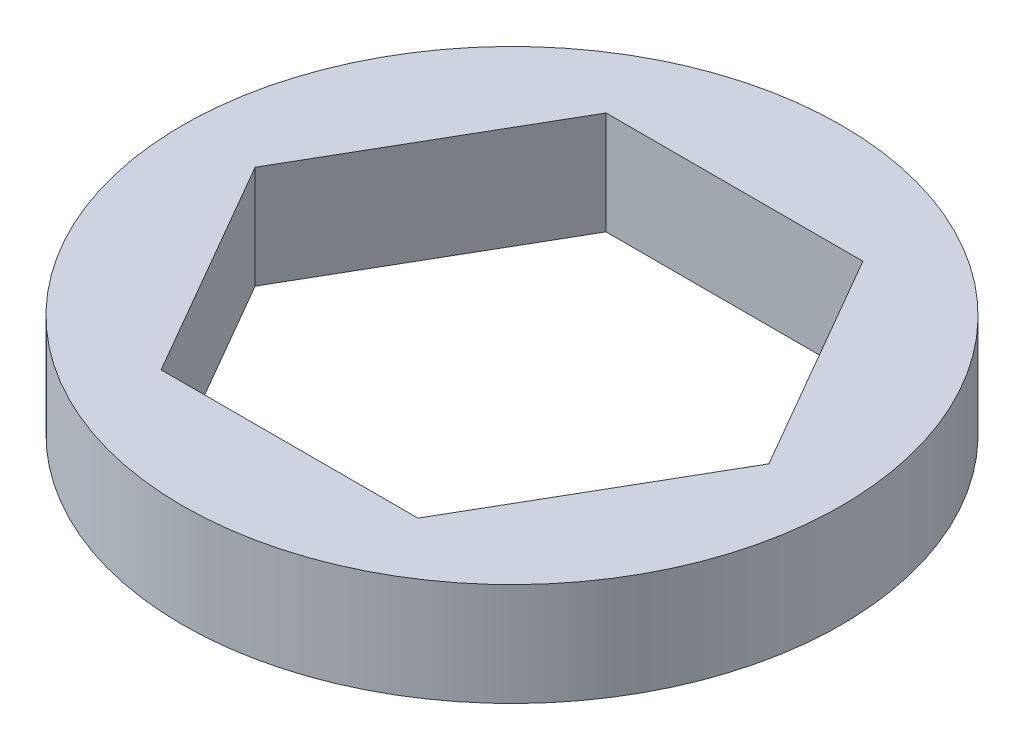
ISO-10303-21;
HEADER;
FILE_DESCRIPTION(('STEP AP214'),'2;1');
FILE_NAME('part.step','',(''),(''),'','','');
FILE_SCHEMA(('AUTOMOTIVE_DESIGN { 1 0 10303 214 1 1 1 1 }'));
ENDSEC;
DATA;
#1=APPLICATION_CONTEXT('core data for automotive mechanical design processes');
#2=APPLICATION_PROTOCOL_DEFINITION('international standard','automotive_design',2000,#1);
#3=PRODUCT_CONTEXT('',#1,'mechanical');
#4=PRODUCT('Part','Part','',(#3));
#5=PRODUCT_RELATED_PRODUCT_CATEGORY('part','',(#4));
#6=PRODUCT_DEFINITION_FORMATION('','',#4);
#7=PRODUCT_DEFINITION_CONTEXT('part definition',#1,'design');
#8=PRODUCT_DEFINITION('design','',#6,#7);
#9=PRODUCT_DEFINITION_SHAPE('','',#8);
#10=(LENGTH_UNIT() NAMED_UNIT(*) SI_UNIT(.MILLI.,.METRE.));
#11=(NAMED_UNIT(*) PLANE_ANGLE_UNIT() SI_UNIT($,.RADIAN.));
#12=(NAMED_UNIT(*) SI_UNIT($,.STERADIAN.) SOLID_ANGLE_UNIT());
#13=UNCERTAINTY_MEASURE_WITH_UNIT(LENGTH_MEASURE(1.E-05),#10,'distance_accuracy_value','');
#14=(GEOMETRIC_REPRESENTATION_CONTEXT(3) GLOBAL_UNCERTAINTY_ASSIGNED_CONTEXT((#13)) GLOBAL_UNIT_ASSIGNED_CONTEXT((#10,
#11,#12)) REPRESENTATION_CONTEXT('',''));
#15=CARTESIAN_POINT('',(0.,0.,0.));
#16=DIRECTION('',(0.,0.,1.));
#17=DIRECTION('',(1.,0.,0.));
#18=AXIS2_PLACEMENT_3D('',#15,#16,#17);
#19=CARTESIAN_POINT('',(0.,3.175,0.));
#20=DIRECTION('',(0.,1.,0.));
#21=DIRECTION('',(0.,0.,1.));
#22=AXIS2_PLACEMENT_3D('',#19,#20,#21);
#23=PLANE('',#22);
#24=CARTESIAN_POINT('',(0.,3.175,0.));
#25=DIRECTION('',(0.,1.,0.));
#26=DIRECTION('',(0.,0.,1.));
#27=AXIS2_PLACEMENT_3D('',#24,#25,#26);
#28=CIRCLE('',#27,10.16);
#29=CARTESIAN_POINT('',(0.,3.175,10.16));
#30=VERTEX_POINT('',#29);
#31=EDGE_CURVE('E11',#30,#30,#28,.T.);
#32=ORIENTED_EDGE('',*,*,#31,.T.);
#33=EDGE_LOOP('',(#32));
#34=FACE_BOUND('',#33,.T.);
#35=DIRECTION('',(-0.5,0.,-0.866025403784438));
#36=VECTOR('',#35,1.);
#37=CARTESIAN_POINT('',(7.9189362922049,3.175,0.));
#38=LINE('',#37,#36);
#39=CARTESIAN_POINT('',(7.9189362922049,3.175,0.));
#40=VERTEX_POINT('',#39);
#41=CARTESIAN_POINT('',(3.95946814610245,3.175,-6.858));
#42=VERTEX_POINT('',#41);
#43=EDGE_CURVE('E115',#40,#42,#38,.T.);
#44=ORIENTED_EDGE('',*,*,#43,.F.);
#45=DIRECTION('',(0.5,0.,-0.866025403784439));
#46=VECTOR('',#45,1.);
#47=CARTESIAN_POINT('',(3.95946814610245,3.175,6.858));
#48=LINE('',#47,#46);
#49=CARTESIAN_POINT('',(3.95946814610245,3.175,6.858));
#50=VERTEX_POINT('',#49);
#51=EDGE_CURVE('E106',#50,#40,#48,.T.);
#52=ORIENTED_EDGE('',*,*,#51,.F.);
#53=DIRECTION('',(1.,0.,0.));
#54=VECTOR('',#53,1.);
#55=CARTESIAN_POINT('',(-3.95946814610245,3.175,6.858));
#56=LINE('',#55,#54);
#57=CARTESIAN_POINT('',(-3.95946814610245,3.175,6.858));
#58=VERTEX_POINT('',#57);
#59=EDGE_CURVE('E141',#58,#50,#56,.T.);
#60=ORIENTED_EDGE('',*,*,#59,.F.);
#61=DIRECTION('',(0.5,0.,0.866025403784439));
#62=VECTOR('',#61,1.);
#63=CARTESIAN_POINT('',(-7.91893629220491,3.175,0.));
#64=LINE('',#63,#62);
#65=CARTESIAN_POINT('',(-7.91893629220491,3.175,0.));
#66=VERTEX_POINT('',#65);
#67=EDGE_CURVE('E138',#66,#58,#64,.T.);
#68=ORIENTED_EDGE('',*,*,#67,.F.);
#69=DIRECTION('',(-0.5,0.,0.866025403784439));
#70=VECTOR('',#69,1.);
#71=CARTESIAN_POINT('',(-3.95946814610245,3.175,-6.858));
#72=LINE('',#71,#70);
#73=CARTESIAN_POINT('',(-3.95946814610245,3.175,-6.858));
#74=VERTEX_POINT('',#73);
#75=EDGE_CURVE('E133',#74,#66,#72,.T.);
#76=ORIENTED_EDGE('',*,*,#75,.F.);
#77=DIRECTION('',(-1.,0.,0.));
#78=VECTOR('',#77,1.);
#79=CARTESIAN_POINT('',(3.95946814610245,3.175,-6.858));
#80=LINE('',#79,#78);
#81=EDGE_CURVE('E128',#42,#74,#80,.T.);
#82=ORIENTED_EDGE('',*,*,#81,.F.);
#83=EDGE_LOOP('',(#44,#52,#60,#68,#76,#82));
#84=FACE_BOUND('',#83,.T.);
#85=ADVANCED_FACE('F40',(#34,#84),#23,.T.);
#86=CARTESIAN_POINT('',(0.,0.,0.));
#87=DIRECTION('',(0.,1.,0.));
#88=DIRECTION('',(0.,0.,1.));
#89=AXIS2_PLACEMENT_3D('',#86,#87,#88);
#90=PLANE('',#89);
#91=CARTESIAN_POINT('',(0.,0.,0.));
#92=DIRECTION('',(0.,1.,0.));
#93=DIRECTION('',(0.,0.,1.));
#94=AXIS2_PLACEMENT_3D('',#91,#92,#93);
#95=CIRCLE('',#94,10.16);
#96=CARTESIAN_POINT('',(0.,0.,10.16));
#97=VERTEX_POINT('',#96);
#98=EDGE_CURVE('E44',#97,#97,#95,.T.);
#99=ORIENTED_EDGE('',*,*,#98,.F.);
#100=EDGE_LOOP('',(#99));
#101=FACE_BOUND('',#100,.T.);
#102=DIRECTION('',(0.5,0.,-0.866025403784439));
#103=VECTOR('',#102,1.);
#104=CARTESIAN_POINT('',(3.95946814610245,0.,6.858));
#105=LINE('',#104,#103);
#106=CARTESIAN_POINT('',(3.95946814610245,0.,6.858));
#107=VERTEX_POINT('',#106);
#108=CARTESIAN_POINT('',(7.9189362922049,0.,0.));
#109=VERTEX_POINT('',#108);
#110=EDGE_CURVE('E69',#107,#109,#105,.T.);
#111=ORIENTED_EDGE('',*,*,#110,.T.);
#112=DIRECTION('',(-0.5,0.,-0.866025403784438));
#113=VECTOR('',#112,1.);
#114=CARTESIAN_POINT('',(7.9189362922049,0.,0.));
#115=LINE('',#114,#113);
#116=CARTESIAN_POINT('',(3.95946814610245,0.,-6.858));
#117=VERTEX_POINT('',#116);
#118=EDGE_CURVE('E122',#109,#117,#115,.T.);
#119=ORIENTED_EDGE('',*,*,#118,.T.);
#120=DIRECTION('',(-1.,0.,0.));
#121=VECTOR('',#120,1.);
#122=CARTESIAN_POINT('',(3.95946814610245,0.,-6.858));
#123=LINE('',#122,#121);
#124=CARTESIAN_POINT('',(-3.95946814610245,0.,-6.858));
#125=VERTEX_POINT('',#124);
#126=EDGE_CURVE('E148',#117,#125,#123,.T.);
#127=ORIENTED_EDGE('',*,*,#126,.T.);
#128=DIRECTION('',(-0.5,0.,0.866025403784439));
#129=VECTOR('',#128,1.);
#130=CARTESIAN_POINT('',(-3.95946814610245,0.,-6.858));
#131=LINE('',#130,#129);
#132=CARTESIAN_POINT('',(-7.91893629220491,0.,0.));
#133=VERTEX_POINT('',#132);
#134=EDGE_CURVE('E152',#125,#133,#131,.T.);
#135=ORIENTED_EDGE('',*,*,#134,.T.);
#136=DIRECTION('',(0.5,0.,0.866025403784439));
#137=VECTOR('',#136,1.);
#138=CARTESIAN_POINT('',(-7.91893629220491,0.,0.));
#139=LINE('',#138,#137);
#140=CARTESIAN_POINT('',(-3.95946814610245,0.,6.858));
#141=VERTEX_POINT('',#140);
#142=EDGE_CURVE('E156',#133,#141,#139,.T.);
#143=ORIENTED_EDGE('',*,*,#142,.T.);
#144=DIRECTION('',(1.,0.,0.));
#145=VECTOR('',#144,1.);
#146=CARTESIAN_POINT('',(-3.95946814610245,0.,6.858));
#147=LINE('',#146,#145);
#148=EDGE_CURVE('E116',#141,#107,#147,.T.);
#149=ORIENTED_EDGE('',*,*,#148,.T.);
#150=EDGE_LOOP('',(#111,#119,#127,#135,#143,#149));
#151=FACE_BOUND('',#150,.T.);
#152=ADVANCED_FACE('F179',(#101,#151),#90,.F.);
#153=CARTESIAN_POINT('',(0.,3.175,0.));
#154=DIRECTION('',(0.,-1.,0.));
#155=DIRECTION('',(0.,0.,-1.));
#156=AXIS2_PLACEMENT_3D('',#153,#154,#155);
#157=CYLINDRICAL_SURFACE('',#156,10.16);
#158=ORIENTED_EDGE('',*,*,#31,.F.);
#159=EDGE_LOOP('',(#158));
#160=FACE_BOUND('',#159,.T.);
#161=ORIENTED_EDGE('',*,*,#98,.T.);
#162=EDGE_LOOP('',(#161));
#163=FACE_BOUND('',#162,.T.);
#164=ADVANCED_FACE('F42',(#160,#163),#157,.T.);
#165=CARTESIAN_POINT('',(3.95946814610245,3.175,6.858));
#166=DIRECTION('',(-0.866025403784439,0.,-0.5));
#167=DIRECTION('',(-0.5,0.,0.866025403784439));
#168=AXIS2_PLACEMENT_3D('',#165,#166,#167);
#169=PLANE('',#168);
#170=ORIENTED_EDGE('',*,*,#110,.F.);
#171=DIRECTION('',(0.,-1.,0.));
#172=VECTOR('',#171,1.);
#173=CARTESIAN_POINT('',(3.95946814610245,3.175,6.858));
#174=LINE('',#173,#172);
#175=EDGE_CURVE('E110',#50,#107,#174,.T.);
#176=ORIENTED_EDGE('',*,*,#175,.F.);
#177=ORIENTED_EDGE('',*,*,#51,.T.);
#178=DIRECTION('',(0.,-1.,0.));
#179=VECTOR('',#178,1.);
#180=CARTESIAN_POINT('',(7.9189362922049,3.175,0.));
#181=LINE('',#180,#179);
#182=EDGE_CURVE('E109',#40,#109,#181,.T.);
#183=ORIENTED_EDGE('',*,*,#182,.T.);
#184=EDGE_LOOP('',(#170,#176,#177,#183));
#185=FACE_BOUND('',#184,.T.);
#186=ADVANCED_FACE('F108',(#185),#169,.T.);
#187=CARTESIAN_POINT('',(7.9189362922049,3.175,0.));
#188=DIRECTION('',(-0.866025403784439,0.,0.5));
#189=DIRECTION('',(0.5,0.,0.866025403784439));
#190=AXIS2_PLACEMENT_3D('',#187,#188,#189);
#191=PLANE('',#190);
#192=ORIENTED_EDGE('',*,*,#118,.F.);
#193=ORIENTED_EDGE('',*,*,#182,.F.);
#194=ORIENTED_EDGE('',*,*,#43,.T.);
#195=DIRECTION('',(0.,-1.,0.));
#196=VECTOR('',#195,1.);
#197=CARTESIAN_POINT('',(3.95946814610245,3.175,-6.858));
#198=LINE('',#197,#196);
#199=EDGE_CURVE('E124',#42,#117,#198,.T.);
#200=ORIENTED_EDGE('',*,*,#199,.T.);
#201=EDGE_LOOP('',(#192,#193,#194,#200));
#202=FACE_BOUND('',#201,.T.);
#203=ADVANCED_FACE('F119',(#202),#191,.T.);
#204=CARTESIAN_POINT('',(3.95946814610245,3.175,-6.858));
#205=DIRECTION('',(0.,0.,1.));
#206=DIRECTION('',(1.,0.,0.));
#207=AXIS2_PLACEMENT_3D('',#204,#205,#206);
#208=PLANE('',#207);
#209=ORIENTED_EDGE('',*,*,#126,.F.);
#210=ORIENTED_EDGE('',*,*,#199,.F.);
#211=ORIENTED_EDGE('',*,*,#81,.T.);
#212=DIRECTION('',(0.,-1.,0.));
#213=VECTOR('',#212,1.);
#214=CARTESIAN_POINT('',(-3.95946814610245,3.175,-6.858));
#215=LINE('',#214,#213);
#216=EDGE_CURVE('E170',#74,#125,#215,.T.);
#217=ORIENTED_EDGE('',*,*,#216,.T.);
#218=EDGE_LOOP('',(#209,#210,#211,#217));
#219=FACE_BOUND('',#218,.T.);
#220=ADVANCED_FACE('F175',(#219),#208,.T.);
#221=CARTESIAN_POINT('',(-3.95946814610245,3.175,-6.858));
#222=DIRECTION('',(0.866025403784439,0.,0.5));
#223=DIRECTION('',(0.5,0.,-0.866025403784439));
#224=AXIS2_PLACEMENT_3D('',#221,#222,#223);
#225=PLANE('',#224);
#226=ORIENTED_EDGE('',*,*,#134,.F.);
#227=ORIENTED_EDGE('',*,*,#216,.F.);
#228=ORIENTED_EDGE('',*,*,#75,.T.);
#229=DIRECTION('',(0.,-1.,0.));
#230=VECTOR('',#229,1.);
#231=CARTESIAN_POINT('',(-7.91893629220491,3.175,0.));
#232=LINE('',#231,#230);
#233=EDGE_CURVE('E167',#66,#133,#232,.T.);
#234=ORIENTED_EDGE('',*,*,#233,.T.);
#235=EDGE_LOOP('',(#226,#227,#228,#234));
#236=FACE_BOUND('',#235,.T.);
#237=ADVANCED_FACE('F187',(#236),#225,.T.);
#238=CARTESIAN_POINT('',(-7.91893629220491,3.175,0.));
#239=DIRECTION('',(0.866025403784438,0.,-0.5));
#240=DIRECTION('',(-0.5,0.,-0.866025403784439));
#241=AXIS2_PLACEMENT_3D('',#238,#239,#240);
#242=PLANE('',#241);
#243=ORIENTED_EDGE('',*,*,#142,.F.);
#244=ORIENTED_EDGE('',*,*,#233,.F.);
#245=ORIENTED_EDGE('',*,*,#67,.T.);
#246=DIRECTION('',(0.,-1.,0.));
#247=VECTOR('',#246,1.);
#248=CARTESIAN_POINT('',(-3.95946814610245,3.175,6.858));
#249=LINE('',#248,#247);
#250=EDGE_CURVE('E59',#58,#141,#249,.T.);
#251=ORIENTED_EDGE('',*,*,#250,.T.);
#252=EDGE_LOOP('',(#243,#244,#245,#251));
#253=FACE_BOUND('',#252,.T.);
#254=ADVANCED_FACE('F185',(#253),#242,.T.);
#255=CARTESIAN_POINT('',(-3.95946814610245,3.175,6.858));
#256=DIRECTION('',(0.,0.,-1.));
#257=DIRECTION('',(-1.,0.,0.));
#258=AXIS2_PLACEMENT_3D('',#255,#256,#257);
#259=PLANE('',#258);
#260=ORIENTED_EDGE('',*,*,#148,.F.);
#261=ORIENTED_EDGE('',*,*,#250,.F.);
#262=ORIENTED_EDGE('',*,*,#59,.T.);
#263=ORIENTED_EDGE('',*,*,#175,.T.);
#264=EDGE_LOOP('',(#260,#261,#262,#263));
#265=FACE_BOUND('',#264,.T.);
#266=ADVANCED_FACE('F181',(#265),#259,.T.);
#267=CLOSED_SHELL('',(#85,#152,#164,#186,#203,#220,#237,#254,#266));
#268=MANIFOLD_SOLID_BREP('B2',#267);
#269=ADVANCED_BREP_SHAPE_REPRESENTATION('',(#18,#268),#14);
#270=SHAPE_DEFINITION_REPRESENTATION(#9,#269);
ENDSEC;
END-ISO-10303-21;
